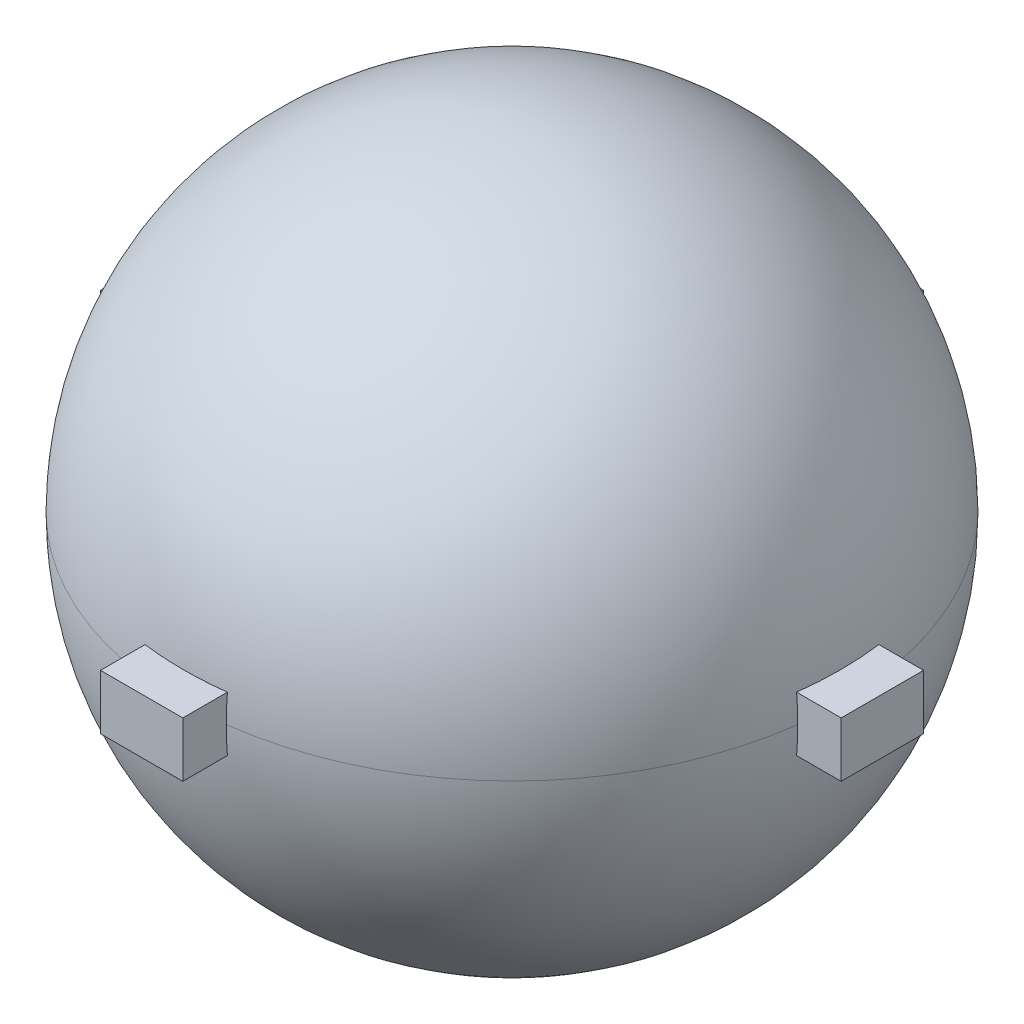
ISO-10303-21;
HEADER;
FILE_DESCRIPTION(('STEP AP214'),'2;1');
FILE_NAME('part.step','',(''),(''),'','','');
FILE_SCHEMA(('AUTOMOTIVE_DESIGN { 1 0 10303 214 1 1 1 1 }'));
ENDSEC;
DATA;
#1=APPLICATION_CONTEXT('core data for automotive mechanical design processes');
#2=APPLICATION_PROTOCOL_DEFINITION('international standard','automotive_design',2000,#1);
#3=PRODUCT_CONTEXT('',#1,'mechanical');
#4=PRODUCT('Part','Part','',(#3));
#5=PRODUCT_RELATED_PRODUCT_CATEGORY('part','',(#4));
#6=PRODUCT_DEFINITION_FORMATION('','',#4);
#7=PRODUCT_DEFINITION_CONTEXT('part definition',#1,'design');
#8=PRODUCT_DEFINITION('design','',#6,#7);
#9=PRODUCT_DEFINITION_SHAPE('','',#8);
#10=(LENGTH_UNIT() NAMED_UNIT(*) SI_UNIT(.MILLI.,.METRE.));
#11=(NAMED_UNIT(*) PLANE_ANGLE_UNIT() SI_UNIT($,.RADIAN.));
#12=(NAMED_UNIT(*) SI_UNIT($,.STERADIAN.) SOLID_ANGLE_UNIT());
#13=UNCERTAINTY_MEASURE_WITH_UNIT(LENGTH_MEASURE(1.E-05),#10,'distance_accuracy_value','');
#14=(GEOMETRIC_REPRESENTATION_CONTEXT(3) GLOBAL_UNCERTAINTY_ASSIGNED_CONTEXT((#13)) GLOBAL_UNIT_ASSIGNED_CONTEXT((#10,
#11,#12)) REPRESENTATION_CONTEXT('',''));
#15=CARTESIAN_POINT('',(0.,0.,0.));
#16=DIRECTION('',(0.,0.,1.));
#17=DIRECTION('',(1.,0.,0.));
#18=AXIS2_PLACEMENT_3D('',#15,#16,#17);
#19=CARTESIAN_POINT('',(0.,304.8,0.));
#20=DIRECTION('',(0.,1.,0.));
#21=DIRECTION('',(0.,0.,1.));
#22=AXIS2_PLACEMENT_3D('',#19,#20,#21);
#23=SPHERICAL_SURFACE('',#22,304.8);
#24=CARTESIAN_POINT('',(-38.1,304.8,-3.9907631702977E-13));
#25=DIRECTION('',(-1.,0.,0.));
#26=DIRECTION('',(0.,0.,1.));
#27=AXIS2_PLACEMENT_3D('',#24,#25,#26);
#28=CIRCLE('',#27,302.409374854683);
#29=CARTESIAN_POINT('',(-38.0999999999969,330.2,-301.340787149699));
#30=VERTEX_POINT('',#29);
#31=CARTESIAN_POINT('',(-38.0999999999968,304.8,-302.409374854683));
#32=VERTEX_POINT('',#31);
#33=EDGE_CURVE('E187',#30,#32,#28,.T.);
#34=ORIENTED_EDGE('',*,*,#33,.T.);
#35=CARTESIAN_POINT('',(0.,304.8,0.));
#36=DIRECTION('',(0.,-1.,0.));
#37=DIRECTION('',(0.,0.,-1.));
#38=AXIS2_PLACEMENT_3D('',#35,#36,#37);
#39=CIRCLE('',#38,304.8);
#40=CARTESIAN_POINT('',(-302.409374854683,304.8,-38.1));
#41=VERTEX_POINT('',#40);
#42=EDGE_CURVE('E341',#41,#32,#39,.T.);
#43=ORIENTED_EDGE('',*,*,#42,.F.);
#44=CARTESIAN_POINT('',(0.,304.8,-38.1));
#45=DIRECTION('',(0.,0.,-1.));
#46=DIRECTION('',(-1.,0.,0.));
#47=AXIS2_PLACEMENT_3D('',#44,#45,#46);
#48=CIRCLE('',#47,302.409374854683);
#49=CARTESIAN_POINT('',(-301.340787149699,330.2,-38.1));
#50=VERTEX_POINT('',#49);
#51=EDGE_CURVE('E217',#41,#50,#48,.T.);
#52=ORIENTED_EDGE('',*,*,#51,.T.);
#53=CARTESIAN_POINT('',(0.,330.2,0.));
#54=DIRECTION('',(0.,1.,0.));
#55=DIRECTION('',(0.,0.,1.));
#56=AXIS2_PLACEMENT_3D('',#53,#54,#55);
#57=CIRCLE('',#56,303.739822874776);
#58=CARTESIAN_POINT('',(-301.340787149699,330.2,38.1));
#59=VERTEX_POINT('',#58);
#60=EDGE_CURVE('E222',#50,#59,#57,.T.);
#61=ORIENTED_EDGE('',*,*,#60,.T.);
#62=CARTESIAN_POINT('',(0.,304.8,38.1));
#63=DIRECTION('',(0.,0.,1.));
#64=DIRECTION('',(1.,0.,0.));
#65=AXIS2_PLACEMENT_3D('',#62,#63,#64);
#66=CIRCLE('',#65,302.409374854683);
#67=CARTESIAN_POINT('',(-302.409374854683,304.8,38.1));
#68=VERTEX_POINT('',#67);
#69=EDGE_CURVE('E219',#59,#68,#66,.T.);
#70=ORIENTED_EDGE('',*,*,#69,.T.);
#71=CARTESIAN_POINT('',(-38.100000000001,304.8,302.409374854683));
#72=VERTEX_POINT('',#71);
#73=EDGE_CURVE('E307',#72,#68,#39,.T.);
#74=ORIENTED_EDGE('',*,*,#73,.F.);
#75=CARTESIAN_POINT('',(-38.1,304.8,-1.33025439009923E-13));
#76=DIRECTION('',(-1.,0.,0.));
#77=DIRECTION('',(0.,0.,1.));
#78=AXIS2_PLACEMENT_3D('',#75,#76,#77);
#79=CIRCLE('',#78,302.409374854683);
#80=CARTESIAN_POINT('',(-38.100000000001,330.2,301.340787149699));
#81=VERTEX_POINT('',#80);
#82=EDGE_CURVE('E247',#72,#81,#79,.T.);
#83=ORIENTED_EDGE('',*,*,#82,.T.);
#84=CARTESIAN_POINT('',(0.,330.2,0.));
#85=DIRECTION('',(0.,1.,0.));
#86=DIRECTION('',(0.,0.,1.));
#87=AXIS2_PLACEMENT_3D('',#84,#85,#86);
#88=CIRCLE('',#87,303.739822874776);
#89=CARTESIAN_POINT('',(38.099999999999,330.2,301.340787149699));
#90=VERTEX_POINT('',#89);
#91=EDGE_CURVE('E252',#81,#90,#88,.T.);
#92=ORIENTED_EDGE('',*,*,#91,.T.);
#93=CARTESIAN_POINT('',(38.1,304.8,1.33025439009923E-13));
#94=DIRECTION('',(1.,0.,0.));
#95=DIRECTION('',(0.,0.,-1.));
#96=AXIS2_PLACEMENT_3D('',#93,#94,#95);
#97=CIRCLE('',#96,302.409374854683);
#98=CARTESIAN_POINT('',(38.099999999999,304.8,302.409374854683));
#99=VERTEX_POINT('',#98);
#100=EDGE_CURVE('E249',#90,#99,#97,.T.);
#101=ORIENTED_EDGE('',*,*,#100,.T.);
#102=CARTESIAN_POINT('',(302.409374854683,304.8,38.1));
#103=VERTEX_POINT('',#102);
#104=EDGE_CURVE('E304',#103,#99,#39,.T.);
#105=ORIENTED_EDGE('',*,*,#104,.F.);
#106=CARTESIAN_POINT('',(0.,304.8,38.1));
#107=DIRECTION('',(0.,0.,1.));
#108=DIRECTION('',(1.,0.,0.));
#109=AXIS2_PLACEMENT_3D('',#106,#107,#108);
#110=CIRCLE('',#109,302.409374854683);
#111=CARTESIAN_POINT('',(301.340787149699,330.2,38.1));
#112=VERTEX_POINT('',#111);
#113=EDGE_CURVE('E299',#103,#112,#110,.T.);
#114=ORIENTED_EDGE('',*,*,#113,.T.);
#115=CARTESIAN_POINT('',(0.,330.2,0.));
#116=DIRECTION('',(0.,1.,0.));
#117=DIRECTION('',(0.,0.,1.));
#118=AXIS2_PLACEMENT_3D('',#115,#116,#117);
#119=CIRCLE('',#118,303.739822874776);
#120=CARTESIAN_POINT('',(301.340787149699,330.2,-38.1));
#121=VERTEX_POINT('',#120);
#122=EDGE_CURVE('E294',#112,#121,#119,.T.);
#123=ORIENTED_EDGE('',*,*,#122,.T.);
#124=CARTESIAN_POINT('',(0.,304.8,-38.1));
#125=DIRECTION('',(0.,0.,-1.));
#126=DIRECTION('',(-1.,0.,0.));
#127=AXIS2_PLACEMENT_3D('',#124,#125,#126);
#128=CIRCLE('',#127,302.409374854683);
#129=CARTESIAN_POINT('',(302.409374854683,304.8,-38.1));
#130=VERTEX_POINT('',#129);
#131=EDGE_CURVE('E277',#121,#130,#128,.T.);
#132=ORIENTED_EDGE('',*,*,#131,.T.);
#133=CARTESIAN_POINT('',(38.1000000000032,304.8,-302.409374854682));
#134=VERTEX_POINT('',#133);
#135=EDGE_CURVE('E296',#134,#130,#39,.T.);
#136=ORIENTED_EDGE('',*,*,#135,.F.);
#137=CARTESIAN_POINT('',(38.1,304.8,3.9907631702977E-13));
#138=DIRECTION('',(1.,0.,0.));
#139=DIRECTION('',(0.,0.,-1.));
#140=AXIS2_PLACEMENT_3D('',#137,#138,#139);
#141=CIRCLE('',#140,302.409374854683);
#142=CARTESIAN_POINT('',(38.1000000000031,330.2,-301.340787149698));
#143=VERTEX_POINT('',#142);
#144=EDGE_CURVE('E63',#134,#143,#141,.T.);
#145=ORIENTED_EDGE('',*,*,#144,.T.);
#146=CARTESIAN_POINT('',(0.,330.2,0.));
#147=DIRECTION('',(0.,1.,0.));
#148=DIRECTION('',(0.,0.,1.));
#149=AXIS2_PLACEMENT_3D('',#146,#147,#148);
#150=CIRCLE('',#149,303.739822874776);
#151=EDGE_CURVE('E58',#143,#30,#150,.T.);
#152=ORIENTED_EDGE('',*,*,#151,.T.);
#153=EDGE_LOOP('',(#34,#43,#52,#61,#70,#74,#83,#92,#101,#105,#114,#123,#132,#136,#145,#152));
#154=FACE_BOUND('',#153,.T.);
#155=ADVANCED_FACE('F42',(#154),#23,.T.);
#156=CARTESIAN_POINT('',(0.,304.8,0.));
#157=DIRECTION('',(0.,1.,0.));
#158=DIRECTION('',(0.,0.,1.));
#159=AXIS2_PLACEMENT_3D('',#156,#157,#158);
#160=SPHERICAL_SURFACE('',#159,304.8);
#161=CARTESIAN_POINT('',(-38.1,304.8,-3.9907631702977E-13));
#162=DIRECTION('',(-1.,0.,0.));
#163=DIRECTION('',(0.,0.,1.));
#164=AXIS2_PLACEMENT_3D('',#161,#162,#163);
#165=CIRCLE('',#164,302.409374854683);
#166=CARTESIAN_POINT('',(-38.0999999999969,279.4,-301.340787149699));
#167=VERTEX_POINT('',#166);
#168=EDGE_CURVE('E11',#167,#32,#165,.F.);
#169=ORIENTED_EDGE('',*,*,#168,.F.);
#170=CARTESIAN_POINT('',(0.,279.4,0.));
#171=DIRECTION('',(0.,-1.,0.));
#172=DIRECTION('',(0.,0.,-1.));
#173=AXIS2_PLACEMENT_3D('',#170,#171,#172);
#174=CIRCLE('',#173,303.739822874776);
#175=CARTESIAN_POINT('',(38.1000000000031,279.4,-301.340787149698));
#176=VERTEX_POINT('',#175);
#177=EDGE_CURVE('E179',#167,#176,#174,.T.);
#178=ORIENTED_EDGE('',*,*,#177,.T.);
#179=EDGE_CURVE('E182',#176,#134,#141,.T.);
#180=ORIENTED_EDGE('',*,*,#179,.T.);
#181=ORIENTED_EDGE('',*,*,#135,.T.);
#182=CARTESIAN_POINT('',(0.,304.8,-38.1));
#183=DIRECTION('',(0.,0.,-1.));
#184=DIRECTION('',(-1.,0.,0.));
#185=AXIS2_PLACEMENT_3D('',#182,#183,#184);
#186=CIRCLE('',#185,302.409374854683);
#187=CARTESIAN_POINT('',(301.340787149699,279.4,-38.1));
#188=VERTEX_POINT('',#187);
#189=EDGE_CURVE('E310',#188,#130,#186,.F.);
#190=ORIENTED_EDGE('',*,*,#189,.F.);
#191=CARTESIAN_POINT('',(0.,279.4,0.));
#192=DIRECTION('',(0.,-1.,0.));
#193=DIRECTION('',(0.,0.,-1.));
#194=AXIS2_PLACEMENT_3D('',#191,#192,#193);
#195=CIRCLE('',#194,303.739822874776);
#196=CARTESIAN_POINT('',(301.340787149699,279.4,38.1));
#197=VERTEX_POINT('',#196);
#198=EDGE_CURVE('E300',#188,#197,#195,.T.);
#199=ORIENTED_EDGE('',*,*,#198,.T.);
#200=EDGE_CURVE('E297',#197,#103,#110,.T.);
#201=ORIENTED_EDGE('',*,*,#200,.T.);
#202=ORIENTED_EDGE('',*,*,#104,.T.);
#203=CARTESIAN_POINT('',(38.1,304.8,1.33025439009923E-13));
#204=DIRECTION('',(1.,0.,0.));
#205=DIRECTION('',(0.,0.,-1.));
#206=AXIS2_PLACEMENT_3D('',#203,#204,#205);
#207=CIRCLE('',#206,302.409374854683);
#208=CARTESIAN_POINT('',(38.099999999999,279.4,301.340787149699));
#209=VERTEX_POINT('',#208);
#210=EDGE_CURVE('E313',#209,#99,#207,.F.);
#211=ORIENTED_EDGE('',*,*,#210,.F.);
#212=CARTESIAN_POINT('',(0.,279.4,0.));
#213=DIRECTION('',(0.,-1.,0.));
#214=DIRECTION('',(0.,0.,-1.));
#215=AXIS2_PLACEMENT_3D('',#212,#213,#214);
#216=CIRCLE('',#215,303.739822874776);
#217=CARTESIAN_POINT('',(-38.100000000001,279.4,301.340787149699));
#218=VERTEX_POINT('',#217);
#219=EDGE_CURVE('E246',#209,#218,#216,.T.);
#220=ORIENTED_EDGE('',*,*,#219,.T.);
#221=EDGE_CURVE('E244',#218,#72,#79,.T.);
#222=ORIENTED_EDGE('',*,*,#221,.T.);
#223=ORIENTED_EDGE('',*,*,#73,.T.);
#224=CARTESIAN_POINT('',(0.,304.8,38.1));
#225=DIRECTION('',(0.,0.,1.));
#226=DIRECTION('',(1.,0.,0.));
#227=AXIS2_PLACEMENT_3D('',#224,#225,#226);
#228=CIRCLE('',#227,302.409374854683);
#229=CARTESIAN_POINT('',(-301.340787149699,279.4,38.1));
#230=VERTEX_POINT('',#229);
#231=EDGE_CURVE('E51',#230,#68,#228,.F.);
#232=ORIENTED_EDGE('',*,*,#231,.F.);
#233=CARTESIAN_POINT('',(0.,279.4,0.));
#234=DIRECTION('',(0.,-1.,0.));
#235=DIRECTION('',(0.,0.,-1.));
#236=AXIS2_PLACEMENT_3D('',#233,#234,#235);
#237=CIRCLE('',#236,303.739822874776);
#238=CARTESIAN_POINT('',(-301.340787149699,279.4,-38.1));
#239=VERTEX_POINT('',#238);
#240=EDGE_CURVE('E216',#230,#239,#237,.T.);
#241=ORIENTED_EDGE('',*,*,#240,.T.);
#242=EDGE_CURVE('E214',#239,#41,#48,.T.);
#243=ORIENTED_EDGE('',*,*,#242,.T.);
#244=ORIENTED_EDGE('',*,*,#42,.T.);
#245=EDGE_LOOP('',(#169,#178,#180,#181,#190,#199,#201,#202,#211,#220,#222,#223,#232,#241,#243,#244));
#246=FACE_BOUND('',#245,.T.);
#247=ADVANCED_FACE('F181',(#246),#160,.T.);
#248=CARTESIAN_POINT('',(-304.801,279.4,-38.1));
#249=DIRECTION('',(0.,0.,-1.));
#250=DIRECTION('',(-1.,0.,0.));
#251=AXIS2_PLACEMENT_3D('',#248,#249,#250);
#252=PLANE('',#251);
#253=ORIENTED_EDGE('',*,*,#131,.F.);
#254=DIRECTION('',(1.,0.,0.));
#255=VECTOR('',#254,1.);
#256=CARTESIAN_POINT('',(-304.801,330.2,-38.1));
#257=LINE('',#256,#255);
#258=CARTESIAN_POINT('',(342.5825,330.2,-38.1));
#259=VERTEX_POINT('',#258);
#260=EDGE_CURVE('E273',#121,#259,#257,.T.);
#261=ORIENTED_EDGE('',*,*,#260,.T.);
#262=DIRECTION('',(0.,1.,0.));
#263=VECTOR('',#262,1.);
#264=CARTESIAN_POINT('',(342.5825,279.4,-38.1));
#265=LINE('',#264,#263);
#266=CARTESIAN_POINT('',(342.5825,279.4,-38.1));
#267=VERTEX_POINT('',#266);
#268=EDGE_CURVE('E284',#267,#259,#265,.T.);
#269=ORIENTED_EDGE('',*,*,#268,.F.);
#270=DIRECTION('',(1.,0.,0.));
#271=VECTOR('',#270,1.);
#272=CARTESIAN_POINT('',(-304.801,279.4,-38.1));
#273=LINE('',#272,#271);
#274=EDGE_CURVE('E288',#188,#267,#273,.T.);
#275=ORIENTED_EDGE('',*,*,#274,.F.);
#276=ORIENTED_EDGE('',*,*,#189,.T.);
#277=EDGE_LOOP('',(#253,#261,#269,#275,#276));
#278=FACE_BOUND('',#277,.T.);
#279=ADVANCED_FACE('F348',(#278),#252,.T.);
#280=CARTESIAN_POINT('',(-304.801,279.4,38.1));
#281=DIRECTION('',(0.,-1.,0.));
#282=DIRECTION('',(0.,0.,-1.));
#283=AXIS2_PLACEMENT_3D('',#280,#281,#282);
#284=PLANE('',#283);
#285=ORIENTED_EDGE('',*,*,#198,.F.);
#286=ORIENTED_EDGE('',*,*,#274,.T.);
#287=DIRECTION('',(0.,0.,-1.));
#288=VECTOR('',#287,1.);
#289=CARTESIAN_POINT('',(342.5825,279.4,38.1));
#290=LINE('',#289,#288);
#291=CARTESIAN_POINT('',(342.5825,279.4,38.1));
#292=VERTEX_POINT('',#291);
#293=EDGE_CURVE('E274',#292,#267,#290,.T.);
#294=ORIENTED_EDGE('',*,*,#293,.F.);
#295=DIRECTION('',(1.,0.,0.));
#296=VECTOR('',#295,1.);
#297=CARTESIAN_POINT('',(-304.801,279.4,38.1));
#298=LINE('',#297,#296);
#299=EDGE_CURVE('E287',#197,#292,#298,.T.);
#300=ORIENTED_EDGE('',*,*,#299,.F.);
#301=EDGE_LOOP('',(#285,#286,#294,#300));
#302=FACE_BOUND('',#301,.T.);
#303=ADVANCED_FACE('F352',(#302),#284,.T.);
#304=CARTESIAN_POINT('',(-304.801,330.2,38.1));
#305=DIRECTION('',(0.,1.,0.));
#306=DIRECTION('',(0.,0.,1.));
#307=AXIS2_PLACEMENT_3D('',#304,#305,#306);
#308=PLANE('',#307);
#309=ORIENTED_EDGE('',*,*,#122,.F.);
#310=DIRECTION('',(1.,0.,0.));
#311=VECTOR('',#310,1.);
#312=CARTESIAN_POINT('',(-304.801,330.2,38.1));
#313=LINE('',#312,#311);
#314=CARTESIAN_POINT('',(342.5825,330.2,38.1));
#315=VERTEX_POINT('',#314);
#316=EDGE_CURVE('E290',#112,#315,#313,.T.);
#317=ORIENTED_EDGE('',*,*,#316,.T.);
#318=DIRECTION('',(0.,0.,1.));
#319=VECTOR('',#318,1.);
#320=CARTESIAN_POINT('',(342.5825,330.2,38.1));
#321=LINE('',#320,#319);
#322=EDGE_CURVE('E281',#259,#315,#321,.T.);
#323=ORIENTED_EDGE('',*,*,#322,.F.);
#324=ORIENTED_EDGE('',*,*,#260,.F.);
#325=EDGE_LOOP('',(#309,#317,#323,#324));
#326=FACE_BOUND('',#325,.T.);
#327=ADVANCED_FACE('F426',(#326),#308,.T.);
#328=CARTESIAN_POINT('',(-304.801,279.4,38.1));
#329=DIRECTION('',(0.,0.,1.));
#330=DIRECTION('',(1.,0.,0.));
#331=AXIS2_PLACEMENT_3D('',#328,#329,#330);
#332=PLANE('',#331);
#333=ORIENTED_EDGE('',*,*,#200,.F.);
#334=ORIENTED_EDGE('',*,*,#299,.T.);
#335=DIRECTION('',(0.,-1.,0.));
#336=VECTOR('',#335,1.);
#337=CARTESIAN_POINT('',(342.5825,279.4,38.1));
#338=LINE('',#337,#336);
#339=EDGE_CURVE('E278',#315,#292,#338,.T.);
#340=ORIENTED_EDGE('',*,*,#339,.F.);
#341=ORIENTED_EDGE('',*,*,#316,.F.);
#342=ORIENTED_EDGE('',*,*,#113,.F.);
#343=EDGE_LOOP('',(#333,#334,#340,#341,#342));
#344=FACE_BOUND('',#343,.T.);
#345=ADVANCED_FACE('F358',(#344),#332,.T.);
#346=CARTESIAN_POINT('',(342.5825,0.,0.));
#347=DIRECTION('',(-1.,0.,0.));
#348=DIRECTION('',(0.,0.,1.));
#349=AXIS2_PLACEMENT_3D('',#346,#347,#348);
#350=PLANE('',#349);
#351=ORIENTED_EDGE('',*,*,#268,.T.);
#352=ORIENTED_EDGE('',*,*,#322,.T.);
#353=ORIENTED_EDGE('',*,*,#339,.T.);
#354=ORIENTED_EDGE('',*,*,#293,.T.);
#355=EDGE_LOOP('',(#351,#352,#353,#354));
#356=FACE_BOUND('',#355,.T.);
#357=ADVANCED_FACE('F391',(#356),#350,.F.);
#358=CARTESIAN_POINT('',(-1.19612040576423E-12,0.,342.5825));
#359=DIRECTION('',(0.,0.,-1.));
#360=DIRECTION('',(-1.,0.,0.));
#361=AXIS2_PLACEMENT_3D('',#358,#359,#360);
#362=PLANE('',#361);
#363=DIRECTION('',(0.,1.,0.));
#364=VECTOR('',#363,1.);
#365=CARTESIAN_POINT('',(38.0999999999988,279.4,342.5825));
#366=LINE('',#365,#364);
#367=CARTESIAN_POINT('',(38.0999999999988,279.4,342.5825));
#368=VERTEX_POINT('',#367);
#369=CARTESIAN_POINT('',(38.0999999999988,330.2,342.5825));
#370=VERTEX_POINT('',#369);
#371=EDGE_CURVE('E243',#368,#370,#366,.T.);
#372=ORIENTED_EDGE('',*,*,#371,.T.);
#373=DIRECTION('',(-1.,0.,0.));
#374=VECTOR('',#373,1.);
#375=CARTESIAN_POINT('',(-38.1000000000012,330.2,342.5825));
#376=LINE('',#375,#374);
#377=CARTESIAN_POINT('',(-38.1000000000012,330.2,342.5825));
#378=VERTEX_POINT('',#377);
#379=EDGE_CURVE('E255',#370,#378,#376,.T.);
#380=ORIENTED_EDGE('',*,*,#379,.T.);
#381=DIRECTION('',(0.,-1.,0.));
#382=VECTOR('',#381,1.);
#383=CARTESIAN_POINT('',(-38.1000000000012,279.4,342.5825));
#384=LINE('',#383,#382);
#385=CARTESIAN_POINT('',(-38.1000000000012,279.4,342.5825));
#386=VERTEX_POINT('',#385);
#387=EDGE_CURVE('E258',#378,#386,#384,.T.);
#388=ORIENTED_EDGE('',*,*,#387,.T.);
#389=DIRECTION('',(1.,0.,0.));
#390=VECTOR('',#389,1.);
#391=CARTESIAN_POINT('',(-38.1000000000012,279.4,342.5825));
#392=LINE('',#391,#390);
#393=EDGE_CURVE('E261',#386,#368,#392,.T.);
#394=ORIENTED_EDGE('',*,*,#393,.T.);
#395=EDGE_LOOP('',(#372,#380,#388,#394));
#396=FACE_BOUND('',#395,.T.);
#397=ADVANCED_FACE('F375',(#396),#362,.F.);
#398=CARTESIAN_POINT('',(-38.0999999999989,330.2,-304.801000000001));
#399=DIRECTION('',(0.,1.,0.));
#400=DIRECTION('',(0.,0.,1.));
#401=AXIS2_PLACEMENT_3D('',#398,#399,#400);
#402=PLANE('',#401);
#403=ORIENTED_EDGE('',*,*,#91,.F.);
#404=DIRECTION('',(0.,0.,1.));
#405=VECTOR('',#404,1.);
#406=CARTESIAN_POINT('',(-38.0999999999989,330.2,-304.801000000001));
#407=LINE('',#406,#405);
#408=EDGE_CURVE('E269',#81,#378,#407,.T.);
#409=ORIENTED_EDGE('',*,*,#408,.T.);
#410=ORIENTED_EDGE('',*,*,#379,.F.);
#411=DIRECTION('',(0.,0.,1.));
#412=VECTOR('',#411,1.);
#413=CARTESIAN_POINT('',(38.1000000000011,330.2,-304.801000000001));
#414=LINE('',#413,#412);
#415=EDGE_CURVE('E264',#90,#370,#414,.T.);
#416=ORIENTED_EDGE('',*,*,#415,.F.);
#417=EDGE_LOOP('',(#403,#409,#410,#416));
#418=FACE_BOUND('',#417,.T.);
#419=ADVANCED_FACE('F383',(#418),#402,.T.);
#420=CARTESIAN_POINT('',(-38.0999999999989,279.4,-304.801000000001));
#421=DIRECTION('',(-1.,0.,0.));
#422=DIRECTION('',(0.,0.,1.));
#423=AXIS2_PLACEMENT_3D('',#420,#421,#422);
#424=PLANE('',#423);
#425=ORIENTED_EDGE('',*,*,#221,.F.);
#426=DIRECTION('',(0.,0.,1.));
#427=VECTOR('',#426,1.);
#428=CARTESIAN_POINT('',(-38.0999999999989,279.4,-304.801000000001));
#429=LINE('',#428,#427);
#430=EDGE_CURVE('E267',#218,#386,#429,.T.);
#431=ORIENTED_EDGE('',*,*,#430,.T.);
#432=ORIENTED_EDGE('',*,*,#387,.F.);
#433=ORIENTED_EDGE('',*,*,#408,.F.);
#434=ORIENTED_EDGE('',*,*,#82,.F.);
#435=EDGE_LOOP('',(#425,#431,#432,#433,#434));
#436=FACE_BOUND('',#435,.T.);
#437=ADVANCED_FACE('F379',(#436),#424,.T.);
#438=CARTESIAN_POINT('',(-38.0999999999989,279.4,-304.801000000001));
#439=DIRECTION('',(0.,-1.,0.));
#440=DIRECTION('',(0.,0.,-1.));
#441=AXIS2_PLACEMENT_3D('',#438,#439,#440);
#442=PLANE('',#441);
#443=ORIENTED_EDGE('',*,*,#219,.F.);
#444=DIRECTION('',(0.,0.,1.));
#445=VECTOR('',#444,1.);
#446=CARTESIAN_POINT('',(38.1000000000011,279.4,-304.801000000001));
#447=LINE('',#446,#445);
#448=EDGE_CURVE('E265',#209,#368,#447,.T.);
#449=ORIENTED_EDGE('',*,*,#448,.T.);
#450=ORIENTED_EDGE('',*,*,#393,.F.);
#451=ORIENTED_EDGE('',*,*,#430,.F.);
#452=EDGE_LOOP('',(#443,#449,#450,#451));
#453=FACE_BOUND('',#452,.T.);
#454=ADVANCED_FACE('F368',(#453),#442,.T.);
#455=CARTESIAN_POINT('',(38.1000000000011,279.4,-304.801000000001));
#456=DIRECTION('',(1.,0.,0.));
#457=DIRECTION('',(0.,0.,-1.));
#458=AXIS2_PLACEMENT_3D('',#455,#456,#457);
#459=PLANE('',#458);
#460=ORIENTED_EDGE('',*,*,#100,.F.);
#461=ORIENTED_EDGE('',*,*,#415,.T.);
#462=ORIENTED_EDGE('',*,*,#371,.F.);
#463=ORIENTED_EDGE('',*,*,#448,.F.);
#464=ORIENTED_EDGE('',*,*,#210,.T.);
#465=EDGE_LOOP('',(#460,#461,#462,#463,#464));
#466=FACE_BOUND('',#465,.T.);
#467=ADVANCED_FACE('F371',(#466),#459,.T.);
#468=CARTESIAN_POINT('',(-342.5825,0.,0.));
#469=DIRECTION('',(1.,0.,0.));
#470=DIRECTION('',(0.,0.,-1.));
#471=AXIS2_PLACEMENT_3D('',#468,#469,#470);
#472=PLANE('',#471);
#473=DIRECTION('',(0.,1.,0.));
#474=VECTOR('',#473,1.);
#475=CARTESIAN_POINT('',(-342.5825,279.4,38.1));
#476=LINE('',#475,#474);
#477=CARTESIAN_POINT('',(-342.5825,279.4,38.1));
#478=VERTEX_POINT('',#477);
#479=CARTESIAN_POINT('',(-342.5825,330.2,38.1));
#480=VERTEX_POINT('',#479);
#481=EDGE_CURVE('E211',#478,#480,#476,.T.);
#482=ORIENTED_EDGE('',*,*,#481,.T.);
#483=DIRECTION('',(0.,0.,-1.));
#484=VECTOR('',#483,1.);
#485=CARTESIAN_POINT('',(-342.5825,330.2,-38.1));
#486=LINE('',#485,#484);
#487=CARTESIAN_POINT('',(-342.5825,330.2,-38.1));
#488=VERTEX_POINT('',#487);
#489=EDGE_CURVE('E225',#480,#488,#486,.T.);
#490=ORIENTED_EDGE('',*,*,#489,.T.);
#491=DIRECTION('',(0.,-1.,0.));
#492=VECTOR('',#491,1.);
#493=CARTESIAN_POINT('',(-342.5825,279.4,-38.1));
#494=LINE('',#493,#492);
#495=CARTESIAN_POINT('',(-342.5825,279.4,-38.1));
#496=VERTEX_POINT('',#495);
#497=EDGE_CURVE('E228',#488,#496,#494,.T.);
#498=ORIENTED_EDGE('',*,*,#497,.T.);
#499=DIRECTION('',(0.,0.,1.));
#500=VECTOR('',#499,1.);
#501=CARTESIAN_POINT('',(-342.5825,279.4,-38.1));
#502=LINE('',#501,#500);
#503=EDGE_CURVE('E231',#496,#478,#502,.T.);
#504=ORIENTED_EDGE('',*,*,#503,.T.);
#505=EDGE_LOOP('',(#482,#490,#498,#504));
#506=FACE_BOUND('',#505,.T.);
#507=ADVANCED_FACE('F335',(#506),#472,.F.);
#508=CARTESIAN_POINT('',(342.5835,330.2,-38.1));
#509=DIRECTION('',(0.,1.,0.));
#510=DIRECTION('',(0.,0.,1.));
#511=AXIS2_PLACEMENT_3D('',#508,#509,#510);
#512=PLANE('',#511);
#513=ORIENTED_EDGE('',*,*,#60,.F.);
#514=DIRECTION('',(-1.,0.,0.));
#515=VECTOR('',#514,1.);
#516=CARTESIAN_POINT('',(342.5835,330.2,-38.1));
#517=LINE('',#516,#515);
#518=EDGE_CURVE('E239',#50,#488,#517,.T.);
#519=ORIENTED_EDGE('',*,*,#518,.T.);
#520=ORIENTED_EDGE('',*,*,#489,.F.);
#521=DIRECTION('',(-1.,0.,0.));
#522=VECTOR('',#521,1.);
#523=CARTESIAN_POINT('',(342.5835,330.2,38.1));
#524=LINE('',#523,#522);
#525=EDGE_CURVE('E234',#59,#480,#524,.T.);
#526=ORIENTED_EDGE('',*,*,#525,.F.);
#527=EDGE_LOOP('',(#513,#519,#520,#526));
#528=FACE_BOUND('',#527,.T.);
#529=ADVANCED_FACE('F339',(#528),#512,.T.);
#530=CARTESIAN_POINT('',(342.5835,279.4,-38.1));
#531=DIRECTION('',(0.,0.,-1.));
#532=DIRECTION('',(-1.,0.,0.));
#533=AXIS2_PLACEMENT_3D('',#530,#531,#532);
#534=PLANE('',#533);
#535=ORIENTED_EDGE('',*,*,#242,.F.);
#536=DIRECTION('',(-1.,0.,0.));
#537=VECTOR('',#536,1.);
#538=CARTESIAN_POINT('',(342.5835,279.4,-38.1));
#539=LINE('',#538,#537);
#540=EDGE_CURVE('E237',#239,#496,#539,.T.);
#541=ORIENTED_EDGE('',*,*,#540,.T.);
#542=ORIENTED_EDGE('',*,*,#497,.F.);
#543=ORIENTED_EDGE('',*,*,#518,.F.);
#544=ORIENTED_EDGE('',*,*,#51,.F.);
#545=EDGE_LOOP('',(#535,#541,#542,#543,#544));
#546=FACE_BOUND('',#545,.T.);
#547=ADVANCED_FACE('F331',(#546),#534,.T.);
#548=CARTESIAN_POINT('',(342.5835,279.4,-38.1));
#549=DIRECTION('',(0.,-1.,0.));
#550=DIRECTION('',(0.,0.,-1.));
#551=AXIS2_PLACEMENT_3D('',#548,#549,#550);
#552=PLANE('',#551);
#553=ORIENTED_EDGE('',*,*,#240,.F.);
#554=DIRECTION('',(-1.,0.,0.));
#555=VECTOR('',#554,1.);
#556=CARTESIAN_POINT('',(342.5835,279.4,38.1));
#557=LINE('',#556,#555);
#558=EDGE_CURVE('E235',#230,#478,#557,.T.);
#559=ORIENTED_EDGE('',*,*,#558,.T.);
#560=ORIENTED_EDGE('',*,*,#503,.F.);
#561=ORIENTED_EDGE('',*,*,#540,.F.);
#562=EDGE_LOOP('',(#553,#559,#560,#561));
#563=FACE_BOUND('',#562,.T.);
#564=ADVANCED_FACE('F327',(#563),#552,.T.);
#565=CARTESIAN_POINT('',(342.5835,279.4,38.1));
#566=DIRECTION('',(0.,0.,1.));
#567=DIRECTION('',(1.,0.,0.));
#568=AXIS2_PLACEMENT_3D('',#565,#566,#567);
#569=PLANE('',#568);
#570=ORIENTED_EDGE('',*,*,#69,.F.);
#571=ORIENTED_EDGE('',*,*,#525,.T.);
#572=ORIENTED_EDGE('',*,*,#481,.F.);
#573=ORIENTED_EDGE('',*,*,#558,.F.);
#574=ORIENTED_EDGE('',*,*,#231,.T.);
#575=EDGE_LOOP('',(#570,#571,#572,#573,#574));
#576=FACE_BOUND('',#575,.T.);
#577=ADVANCED_FACE('F319',(#576),#569,.T.);
#578=CARTESIAN_POINT('',(-38.1000000000032,279.4,304.801000000003));
#579=DIRECTION('',(-1.,0.,0.));
#580=DIRECTION('',(0.,0.,1.));
#581=AXIS2_PLACEMENT_3D('',#578,#579,#580);
#582=PLANE('',#581);
#583=ORIENTED_EDGE('',*,*,#33,.F.);
#584=DIRECTION('',(0.,0.,-1.));
#585=VECTOR('',#584,1.);
#586=CARTESIAN_POINT('',(-38.1000000000032,330.2,304.801000000003));
#587=LINE('',#586,#585);
#588=CARTESIAN_POINT('',(-38.0999999999964,330.2,-342.5825));
#589=VERTEX_POINT('',#588);
#590=EDGE_CURVE('E209',#30,#589,#587,.T.);
#591=ORIENTED_EDGE('',*,*,#590,.T.);
#592=DIRECTION('',(0.,1.,0.));
#593=VECTOR('',#592,1.);
#594=CARTESIAN_POINT('',(-38.0999999999964,279.4,-342.5825));
#595=LINE('',#594,#593);
#596=CARTESIAN_POINT('',(-38.0999999999964,279.4,-342.5825));
#597=VERTEX_POINT('',#596);
#598=EDGE_CURVE('E199',#597,#589,#595,.T.);
#599=ORIENTED_EDGE('',*,*,#598,.F.);
#600=DIRECTION('',(0.,0.,-1.));
#601=VECTOR('',#600,1.);
#602=CARTESIAN_POINT('',(-38.1000000000032,279.4,304.801000000003));
#603=LINE('',#602,#601);
#604=EDGE_CURVE('E200',#167,#597,#603,.T.);
#605=ORIENTED_EDGE('',*,*,#604,.F.);
#606=ORIENTED_EDGE('',*,*,#168,.T.);
#607=EDGE_LOOP('',(#583,#591,#599,#605,#606));
#608=FACE_BOUND('',#607,.T.);
#609=ADVANCED_FACE('F516',(#608),#582,.T.);
#610=CARTESIAN_POINT('',(38.0999999999968,330.2,304.801000000004));
#611=DIRECTION('',(0.,1.,0.));
#612=DIRECTION('',(0.,0.,1.));
#613=AXIS2_PLACEMENT_3D('',#610,#611,#612);
#614=PLANE('',#613);
#615=ORIENTED_EDGE('',*,*,#151,.F.);
#616=DIRECTION('',(0.,0.,-1.));
#617=VECTOR('',#616,1.);
#618=CARTESIAN_POINT('',(38.0999999999968,330.2,304.801000000004));
#619=LINE('',#618,#617);
#620=CARTESIAN_POINT('',(38.1000000000036,330.2,-342.5825));
#621=VERTEX_POINT('',#620);
#622=EDGE_CURVE('E205',#143,#621,#619,.T.);
#623=ORIENTED_EDGE('',*,*,#622,.T.);
#624=DIRECTION('',(1.,0.,0.));
#625=VECTOR('',#624,1.);
#626=CARTESIAN_POINT('',(38.1000000000036,330.2,-342.5825));
#627=LINE('',#626,#625);
#628=EDGE_CURVE('E203',#589,#621,#627,.T.);
#629=ORIENTED_EDGE('',*,*,#628,.F.);
#630=ORIENTED_EDGE('',*,*,#590,.F.);
#631=EDGE_LOOP('',(#615,#623,#629,#630));
#632=FACE_BOUND('',#631,.T.);
#633=ADVANCED_FACE('F525',(#632),#614,.T.);
#634=CARTESIAN_POINT('',(38.0999999999968,279.4,304.801000000004));
#635=DIRECTION('',(0.,-1.,0.));
#636=DIRECTION('',(0.,0.,-1.));
#637=AXIS2_PLACEMENT_3D('',#634,#635,#636);
#638=PLANE('',#637);
#639=ORIENTED_EDGE('',*,*,#177,.F.);
#640=ORIENTED_EDGE('',*,*,#604,.T.);
#641=DIRECTION('',(-1.,0.,0.));
#642=VECTOR('',#641,1.);
#643=CARTESIAN_POINT('',(38.1000000000036,279.4,-342.5825));
#644=LINE('',#643,#642);
#645=CARTESIAN_POINT('',(38.1000000000036,279.4,-342.5825));
#646=VERTEX_POINT('',#645);
#647=EDGE_CURVE('E198',#646,#597,#644,.T.);
#648=ORIENTED_EDGE('',*,*,#647,.F.);
#649=DIRECTION('',(0.,0.,-1.));
#650=VECTOR('',#649,1.);
#651=CARTESIAN_POINT('',(38.0999999999968,279.4,304.801000000004));
#652=LINE('',#651,#650);
#653=EDGE_CURVE('E192',#176,#646,#652,.T.);
#654=ORIENTED_EDGE('',*,*,#653,.F.);
#655=EDGE_LOOP('',(#639,#640,#648,#654));
#656=FACE_BOUND('',#655,.T.);
#657=ADVANCED_FACE('F196',(#656),#638,.T.);
#658=CARTESIAN_POINT('',(38.0999999999968,279.4,304.801000000004));
#659=DIRECTION('',(1.,0.,0.));
#660=DIRECTION('',(0.,0.,-1.));
#661=AXIS2_PLACEMENT_3D('',#658,#659,#660);
#662=PLANE('',#661);
#663=ORIENTED_EDGE('',*,*,#179,.F.);
#664=ORIENTED_EDGE('',*,*,#653,.T.);
#665=DIRECTION('',(0.,-1.,0.));
#666=VECTOR('',#665,1.);
#667=CARTESIAN_POINT('',(38.1000000000036,279.4,-342.5825));
#668=LINE('',#667,#666);
#669=EDGE_CURVE('E569',#621,#646,#668,.T.);
#670=ORIENTED_EDGE('',*,*,#669,.F.);
#671=ORIENTED_EDGE('',*,*,#622,.F.);
#672=ORIENTED_EDGE('',*,*,#144,.F.);
#673=EDGE_LOOP('',(#663,#664,#670,#671,#672));
#674=FACE_BOUND('',#673,.T.);
#675=ADVANCED_FACE('F190',(#674),#662,.T.);
#676=CARTESIAN_POINT('',(3.58836121729268E-12,0.,-342.5825));
#677=DIRECTION('',(0.,0.,1.));
#678=DIRECTION('',(1.,0.,0.));
#679=AXIS2_PLACEMENT_3D('',#676,#677,#678);
#680=PLANE('',#679);
#681=ORIENTED_EDGE('',*,*,#598,.T.);
#682=ORIENTED_EDGE('',*,*,#628,.T.);
#683=ORIENTED_EDGE('',*,*,#669,.T.);
#684=ORIENTED_EDGE('',*,*,#647,.T.);
#685=EDGE_LOOP('',(#681,#682,#683,#684));
#686=FACE_BOUND('',#685,.T.);
#687=ADVANCED_FACE('F552',(#686),#680,.F.);
#688=CLOSED_SHELL('',(#155,#247,#279,#303,#327,#345,#357,#397,#419,#437,#454,#467,#507,#529,
#547,#564,#577,#609,#633,#657,#675,#687));
#689=CARTESIAN_POINT('',(0.,304.8,0.));
#690=DIRECTION('',(0.,1.,0.));
#691=DIRECTION('',(0.,0.,1.));
#692=AXIS2_PLACEMENT_3D('',#689,#690,#691);
#693=SPHERICAL_SURFACE('',#692,301.625);
#694=CARTESIAN_POINT('',(0.,304.8,0.));
#695=DIRECTION('',(0.,1.,0.));
#696=DIRECTION('',(0.,0.,1.));
#697=AXIS2_PLACEMENT_3D('',#694,#695,#696);
#698=CIRCLE('',#697,301.625);
#699=CARTESIAN_POINT('',(0.,304.8,301.625));
#700=VERTEX_POINT('',#699);
#701=EDGE_CURVE('E306',#700,#700,#698,.F.);
#702=ORIENTED_EDGE('',*,*,#701,.T.);
#703=EDGE_LOOP('',(#702));
#704=FACE_BOUND('',#703,.T.);
#705=ADVANCED_FACE('F402',(#704),#693,.F.);
#706=CARTESIAN_POINT('',(0.,304.8,0.));
#707=DIRECTION('',(0.,1.,0.));
#708=DIRECTION('',(0.,0.,1.));
#709=AXIS2_PLACEMENT_3D('',#706,#707,#708);
#710=SPHERICAL_SURFACE('',#709,301.625);
#711=ORIENTED_EDGE('',*,*,#701,.F.);
#712=EDGE_LOOP('',(#711));
#713=FACE_BOUND('',#712,.T.);
#714=ADVANCED_FACE('F44',(#713),#710,.F.);
#715=CLOSED_SHELL('',(#705,#714));
#716=ORIENTED_CLOSED_SHELL('',*,#715,.T.);
#717=BREP_WITH_VOIDS('B2',#688,(#716));
#718=ADVANCED_BREP_SHAPE_REPRESENTATION('',(#18,#717),#14);
#719=SHAPE_DEFINITION_REPRESENTATION(#9,#718);
ENDSEC;
END-ISO-10303-21;
